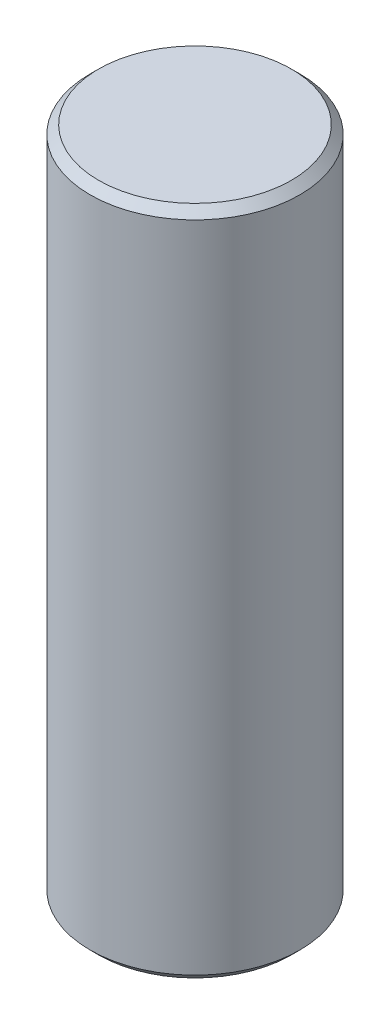
ISO-10303-21;
HEADER;
FILE_DESCRIPTION(('STEP AP214'),'2;1');
FILE_NAME('part.step','',(''),(''),'','','');
FILE_SCHEMA(('AUTOMOTIVE_DESIGN { 1 0 10303 214 1 1 1 1 }'));
ENDSEC;
DATA;
#1=APPLICATION_CONTEXT('core data for automotive mechanical design processes');
#2=APPLICATION_PROTOCOL_DEFINITION('international standard','automotive_design',2000,#1);
#3=PRODUCT_CONTEXT('',#1,'mechanical');
#4=PRODUCT('Part','Part','',(#3));
#5=PRODUCT_RELATED_PRODUCT_CATEGORY('part','',(#4));
#6=PRODUCT_DEFINITION_FORMATION('','',#4);
#7=PRODUCT_DEFINITION_CONTEXT('part definition',#1,'design');
#8=PRODUCT_DEFINITION('design','',#6,#7);
#9=PRODUCT_DEFINITION_SHAPE('','',#8);
#10=(LENGTH_UNIT() NAMED_UNIT(*) SI_UNIT(.MILLI.,.METRE.));
#11=(NAMED_UNIT(*) PLANE_ANGLE_UNIT() SI_UNIT($,.RADIAN.));
#12=(NAMED_UNIT(*) SI_UNIT($,.STERADIAN.) SOLID_ANGLE_UNIT());
#13=UNCERTAINTY_MEASURE_WITH_UNIT(LENGTH_MEASURE(1.E-05),#10,'distance_accuracy_value','');
#14=(GEOMETRIC_REPRESENTATION_CONTEXT(3) GLOBAL_UNCERTAINTY_ASSIGNED_CONTEXT((#13)) GLOBAL_UNIT_ASSIGNED_CONTEXT((#10,
#11,#12)) REPRESENTATION_CONTEXT('',''));
#15=CARTESIAN_POINT('',(0.,0.,0.));
#16=DIRECTION('',(0.,0.,1.));
#17=DIRECTION('',(1.,0.,0.));
#18=AXIS2_PLACEMENT_3D('',#15,#16,#17);
#19=CARTESIAN_POINT('',(0.,8.,0.));
#20=DIRECTION('',(0.,-1.,0.));
#21=DIRECTION('',(0.,0.,-1.));
#22=AXIS2_PLACEMENT_3D('',#19,#20,#21);
#23=CYLINDRICAL_SURFACE('',#22,2.5);
#24=CARTESIAN_POINT('',(0.,-7.8,0.));
#25=DIRECTION('',(0.,1.,0.));
#26=DIRECTION('',(0.,0.,1.));
#27=AXIS2_PLACEMENT_3D('',#24,#25,#26);
#28=CIRCLE('',#27,2.5);
#29=CARTESIAN_POINT('',(0.,-7.8,2.5));
#30=VERTEX_POINT('',#29);
#31=EDGE_CURVE('E49',#30,#30,#28,.T.);
#32=ORIENTED_EDGE('',*,*,#31,.T.);
#33=EDGE_LOOP('',(#32));
#34=FACE_BOUND('',#33,.T.);
#35=CARTESIAN_POINT('',(0.,7.8,0.));
#36=DIRECTION('',(0.,1.,0.));
#37=DIRECTION('',(0.,0.,1.));
#38=AXIS2_PLACEMENT_3D('',#35,#36,#37);
#39=CIRCLE('',#38,2.5);
#40=CARTESIAN_POINT('',(0.,7.8,2.5));
#41=VERTEX_POINT('',#40);
#42=EDGE_CURVE('E53',#41,#41,#39,.F.);
#43=ORIENTED_EDGE('',*,*,#42,.T.);
#44=EDGE_LOOP('',(#43));
#45=FACE_BOUND('',#44,.T.);
#46=ADVANCED_FACE('F37',(#34,#45),#23,.T.);
#47=CARTESIAN_POINT('',(0.,8.,0.));
#48=DIRECTION('',(0.,1.,0.));
#49=DIRECTION('',(0.,0.,1.));
#50=AXIS2_PLACEMENT_3D('',#47,#48,#49);
#51=PLANE('',#50);
#52=CARTESIAN_POINT('',(0.,8.,0.));
#53=DIRECTION('',(0.,1.,0.));
#54=DIRECTION('',(0.,0.,1.));
#55=AXIS2_PLACEMENT_3D('',#52,#53,#54);
#56=CIRCLE('',#55,2.3);
#57=CARTESIAN_POINT('',(0.,8.,2.3));
#58=VERTEX_POINT('',#57);
#59=EDGE_CURVE('E10',#58,#58,#56,.T.);
#60=ORIENTED_EDGE('',*,*,#59,.T.);
#61=EDGE_LOOP('',(#60));
#62=FACE_BOUND('',#61,.T.);
#63=ADVANCED_FACE('F69',(#62),#51,.T.);
#64=CARTESIAN_POINT('',(0.,-8.,0.));
#65=DIRECTION('',(0.,1.,0.));
#66=DIRECTION('',(0.,0.,1.));
#67=AXIS2_PLACEMENT_3D('',#64,#65,#66);
#68=PLANE('',#67);
#69=CARTESIAN_POINT('',(0.,-8.,0.));
#70=DIRECTION('',(0.,1.,0.));
#71=DIRECTION('',(0.,0.,1.));
#72=AXIS2_PLACEMENT_3D('',#69,#70,#71);
#73=CIRCLE('',#72,2.3);
#74=CARTESIAN_POINT('',(0.,-8.,2.3));
#75=VERTEX_POINT('',#74);
#76=EDGE_CURVE('E45',#75,#75,#73,.F.);
#77=ORIENTED_EDGE('',*,*,#76,.T.);
#78=EDGE_LOOP('',(#77));
#79=FACE_BOUND('',#78,.T.);
#80=ADVANCED_FACE('F66',(#79),#68,.F.);
#81=CARTESIAN_POINT('',(0.,-7.8,0.));
#82=DIRECTION('',(0.,1.,0.));
#83=DIRECTION('',(0.,0.,1.));
#84=AXIS2_PLACEMENT_3D('',#81,#82,#83);
#85=CONICAL_SURFACE('',#84,2.5,0.785398163397448);
#86=ORIENTED_EDGE('',*,*,#76,.F.);
#87=EDGE_LOOP('',(#86));
#88=FACE_BOUND('',#87,.T.);
#89=ORIENTED_EDGE('',*,*,#31,.F.);
#90=EDGE_LOOP('',(#89));
#91=FACE_BOUND('',#90,.T.);
#92=ADVANCED_FACE('F62',(#88,#91),#85,.T.);
#93=CARTESIAN_POINT('',(0.,8.,0.));
#94=DIRECTION('',(0.,-1.,0.));
#95=DIRECTION('',(0.,0.,-1.));
#96=AXIS2_PLACEMENT_3D('',#93,#94,#95);
#97=CONICAL_SURFACE('',#96,2.3,0.785398163397448);
#98=ORIENTED_EDGE('',*,*,#42,.F.);
#99=EDGE_LOOP('',(#98));
#100=FACE_BOUND('',#99,.T.);
#101=ORIENTED_EDGE('',*,*,#59,.F.);
#102=EDGE_LOOP('',(#101));
#103=FACE_BOUND('',#102,.T.);
#104=ADVANCED_FACE('F40',(#100,#103),#97,.T.);
#105=CLOSED_SHELL('',(#46,#63,#80,#92,#104));
#106=MANIFOLD_SOLID_BREP('B2',#105);
#107=ADVANCED_BREP_SHAPE_REPRESENTATION('',(#18,#106),#14);
#108=SHAPE_DEFINITION_REPRESENTATION(#9,#107);
ENDSEC;
END-ISO-10303-21;
